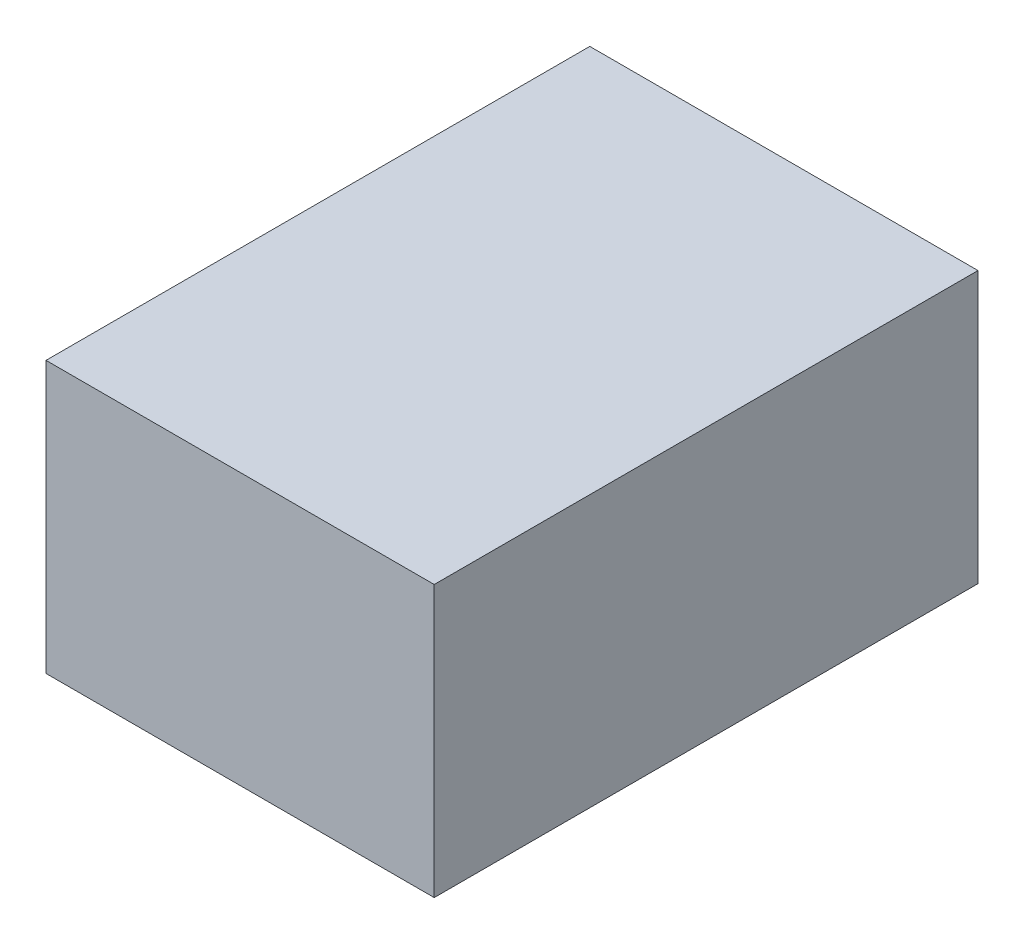
ISO-10303-21;
HEADER;
FILE_DESCRIPTION(('STEP AP214'),'2;1');
FILE_NAME('part.step','',(''),(''),'','','');
FILE_SCHEMA(('AUTOMOTIVE_DESIGN { 1 0 10303 214 1 1 1 1 }'));
ENDSEC;
DATA;
#1=APPLICATION_CONTEXT('core data for automotive mechanical design processes');
#2=APPLICATION_PROTOCOL_DEFINITION('international standard','automotive_design',2000,#1);
#3=PRODUCT_CONTEXT('',#1,'mechanical');
#4=PRODUCT('Part','Part','',(#3));
#5=PRODUCT_RELATED_PRODUCT_CATEGORY('part','',(#4));
#6=PRODUCT_DEFINITION_FORMATION('','',#4);
#7=PRODUCT_DEFINITION_CONTEXT('part definition',#1,'design');
#8=PRODUCT_DEFINITION('design','',#6,#7);
#9=PRODUCT_DEFINITION_SHAPE('','',#8);
#10=(LENGTH_UNIT() NAMED_UNIT(*) SI_UNIT(.MILLI.,.METRE.));
#11=(NAMED_UNIT(*) PLANE_ANGLE_UNIT() SI_UNIT($,.RADIAN.));
#12=(NAMED_UNIT(*) SI_UNIT($,.STERADIAN.) SOLID_ANGLE_UNIT());
#13=UNCERTAINTY_MEASURE_WITH_UNIT(LENGTH_MEASURE(1.E-05),#10,'distance_accuracy_value','');
#14=(GEOMETRIC_REPRESENTATION_CONTEXT(3) GLOBAL_UNCERTAINTY_ASSIGNED_CONTEXT((#13)) GLOBAL_UNIT_ASSIGNED_CONTEXT((#10,
#11,#12)) REPRESENTATION_CONTEXT('',''));
#15=CARTESIAN_POINT('',(0.,0.,0.));
#16=DIRECTION('',(0.,0.,1.));
#17=DIRECTION('',(1.,0.,0.));
#18=AXIS2_PLACEMENT_3D('',#15,#16,#17);
#19=CARTESIAN_POINT('',(0.,19.,0.));
#20=DIRECTION('',(1.,0.,0.));
#21=DIRECTION('',(0.,0.,-1.));
#22=AXIS2_PLACEMENT_3D('',#19,#20,#21);
#23=PLANE('',#22);
#24=DIRECTION('',(0.,0.,1.));
#25=VECTOR('',#24,1.);
#26=CARTESIAN_POINT('',(0.,0.,0.));
#27=LINE('',#26,#25);
#28=CARTESIAN_POINT('',(0.,0.,-38.1));
#29=VERTEX_POINT('',#28);
#30=CARTESIAN_POINT('',(0.,0.,0.));
#31=VERTEX_POINT('',#30);
#32=EDGE_CURVE('E97',#29,#31,#27,.T.);
#33=ORIENTED_EDGE('',*,*,#32,.T.);
#34=DIRECTION('',(0.,-1.,0.));
#35=VECTOR('',#34,1.);
#36=CARTESIAN_POINT('',(0.,19.,0.));
#37=LINE('',#36,#35);
#38=CARTESIAN_POINT('',(0.,19.,0.));
#39=VERTEX_POINT('',#38);
#40=EDGE_CURVE('E11',#39,#31,#37,.T.);
#41=ORIENTED_EDGE('',*,*,#40,.F.);
#42=DIRECTION('',(0.,0.,1.));
#43=VECTOR('',#42,1.);
#44=CARTESIAN_POINT('',(0.,19.,0.));
#45=LINE('',#44,#43);
#46=CARTESIAN_POINT('',(0.,19.,-38.1));
#47=VERTEX_POINT('',#46);
#48=EDGE_CURVE('E85',#47,#39,#45,.T.);
#49=ORIENTED_EDGE('',*,*,#48,.F.);
#50=DIRECTION('',(0.,-1.,0.));
#51=VECTOR('',#50,1.);
#52=CARTESIAN_POINT('',(0.,19.,-38.1));
#53=LINE('',#52,#51);
#54=EDGE_CURVE('E93',#47,#29,#53,.T.);
#55=ORIENTED_EDGE('',*,*,#54,.T.);
#56=EDGE_LOOP('',(#33,#41,#49,#55));
#57=FACE_BOUND('',#56,.T.);
#58=ADVANCED_FACE('F34',(#57),#23,.F.);
#59=CARTESIAN_POINT('',(0.,19.,0.));
#60=DIRECTION('',(0.,0.,-1.));
#61=DIRECTION('',(-1.,0.,0.));
#62=AXIS2_PLACEMENT_3D('',#59,#60,#61);
#63=PLANE('',#62);
#64=DIRECTION('',(1.,0.,0.));
#65=VECTOR('',#64,1.);
#66=CARTESIAN_POINT('',(0.,0.,0.));
#67=LINE('',#66,#65);
#68=CARTESIAN_POINT('',(27.2,0.,0.));
#69=VERTEX_POINT('',#68);
#70=EDGE_CURVE('E89',#31,#69,#67,.T.);
#71=ORIENTED_EDGE('',*,*,#70,.T.);
#72=DIRECTION('',(0.,-1.,0.));
#73=VECTOR('',#72,1.);
#74=CARTESIAN_POINT('',(27.2,19.,0.));
#75=LINE('',#74,#73);
#76=CARTESIAN_POINT('',(27.2,19.,0.));
#77=VERTEX_POINT('',#76);
#78=EDGE_CURVE('E42',#77,#69,#75,.T.);
#79=ORIENTED_EDGE('',*,*,#78,.F.);
#80=DIRECTION('',(1.,0.,0.));
#81=VECTOR('',#80,1.);
#82=CARTESIAN_POINT('',(0.,19.,0.));
#83=LINE('',#82,#81);
#84=EDGE_CURVE('E80',#39,#77,#83,.T.);
#85=ORIENTED_EDGE('',*,*,#84,.F.);
#86=ORIENTED_EDGE('',*,*,#40,.T.);
#87=EDGE_LOOP('',(#71,#79,#85,#86));
#88=FACE_BOUND('',#87,.T.);
#89=ADVANCED_FACE('F88',(#88),#63,.F.);
#90=CARTESIAN_POINT('',(27.2,19.,0.));
#91=DIRECTION('',(-1.,0.,0.));
#92=DIRECTION('',(0.,0.,1.));
#93=AXIS2_PLACEMENT_3D('',#90,#91,#92);
#94=PLANE('',#93);
#95=DIRECTION('',(0.,0.,-1.));
#96=VECTOR('',#95,1.);
#97=CARTESIAN_POINT('',(27.2,0.,0.));
#98=LINE('',#97,#96);
#99=CARTESIAN_POINT('',(27.2,0.,-38.1));
#100=VERTEX_POINT('',#99);
#101=EDGE_CURVE('E67',#69,#100,#98,.T.);
#102=ORIENTED_EDGE('',*,*,#101,.T.);
#103=DIRECTION('',(0.,-1.,0.));
#104=VECTOR('',#103,1.);
#105=CARTESIAN_POINT('',(27.2,19.,-38.1));
#106=LINE('',#105,#104);
#107=CARTESIAN_POINT('',(27.2,19.,-38.1));
#108=VERTEX_POINT('',#107);
#109=EDGE_CURVE('E90',#108,#100,#106,.T.);
#110=ORIENTED_EDGE('',*,*,#109,.F.);
#111=DIRECTION('',(0.,0.,-1.));
#112=VECTOR('',#111,1.);
#113=CARTESIAN_POINT('',(27.2,19.,0.));
#114=LINE('',#113,#112);
#115=EDGE_CURVE('E83',#77,#108,#114,.T.);
#116=ORIENTED_EDGE('',*,*,#115,.F.);
#117=ORIENTED_EDGE('',*,*,#78,.T.);
#118=EDGE_LOOP('',(#102,#110,#116,#117));
#119=FACE_BOUND('',#118,.T.);
#120=ADVANCED_FACE('F91',(#119),#94,.F.);
#121=CARTESIAN_POINT('',(0.,19.,-38.1));
#122=DIRECTION('',(0.,0.,1.));
#123=DIRECTION('',(1.,0.,0.));
#124=AXIS2_PLACEMENT_3D('',#121,#122,#123);
#125=PLANE('',#124);
#126=DIRECTION('',(-1.,0.,0.));
#127=VECTOR('',#126,1.);
#128=CARTESIAN_POINT('',(0.,0.,-38.1));
#129=LINE('',#128,#127);
#130=EDGE_CURVE('E73',#100,#29,#129,.T.);
#131=ORIENTED_EDGE('',*,*,#130,.T.);
#132=ORIENTED_EDGE('',*,*,#54,.F.);
#133=DIRECTION('',(-1.,0.,0.));
#134=VECTOR('',#133,1.);
#135=CARTESIAN_POINT('',(0.,19.,-38.1));
#136=LINE('',#135,#134);
#137=EDGE_CURVE('E50',#108,#47,#136,.T.);
#138=ORIENTED_EDGE('',*,*,#137,.F.);
#139=ORIENTED_EDGE('',*,*,#109,.T.);
#140=EDGE_LOOP('',(#131,#132,#138,#139));
#141=FACE_BOUND('',#140,.T.);
#142=ADVANCED_FACE('F104',(#141),#125,.F.);
#143=CARTESIAN_POINT('',(0.,19.,0.));
#144=DIRECTION('',(0.,-1.,0.));
#145=DIRECTION('',(0.,0.,-1.));
#146=AXIS2_PLACEMENT_3D('',#143,#144,#145);
#147=PLANE('',#146);
#148=ORIENTED_EDGE('',*,*,#48,.T.);
#149=ORIENTED_EDGE('',*,*,#84,.T.);
#150=ORIENTED_EDGE('',*,*,#115,.T.);
#151=ORIENTED_EDGE('',*,*,#137,.T.);
#152=EDGE_LOOP('',(#148,#149,#150,#151));
#153=FACE_BOUND('',#152,.T.);
#154=ADVANCED_FACE('F81',(#153),#147,.F.);
#155=CARTESIAN_POINT('',(0.,0.,0.));
#156=DIRECTION('',(0.,-1.,0.));
#157=DIRECTION('',(0.,0.,-1.));
#158=AXIS2_PLACEMENT_3D('',#155,#156,#157);
#159=PLANE('',#158);
#160=ORIENTED_EDGE('',*,*,#32,.F.);
#161=ORIENTED_EDGE('',*,*,#130,.F.);
#162=ORIENTED_EDGE('',*,*,#101,.F.);
#163=ORIENTED_EDGE('',*,*,#70,.F.);
#164=EDGE_LOOP('',(#160,#161,#162,#163));
#165=FACE_BOUND('',#164,.T.);
#166=ADVANCED_FACE('F107',(#165),#159,.T.);
#167=CLOSED_SHELL('',(#58,#89,#120,#142,#154,#166));
#168=MANIFOLD_SOLID_BREP('B2',#167);
#169=ADVANCED_BREP_SHAPE_REPRESENTATION('',(#18,#168),#14);
#170=SHAPE_DEFINITION_REPRESENTATION(#9,#169);
ENDSEC;
END-ISO-10303-21;
